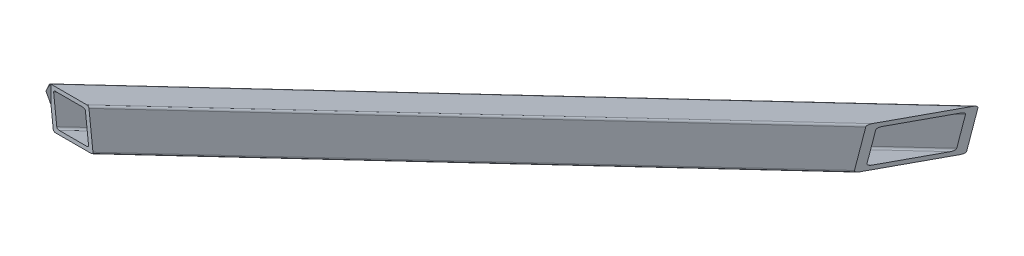
ISO-10303-21;
HEADER;
FILE_DESCRIPTION(('STEP AP214'),'2;1');
FILE_NAME('part.step','',(''),(''),'','','');
FILE_SCHEMA(('AUTOMOTIVE_DESIGN { 1 0 10303 214 1 1 1 1 }'));
ENDSEC;
DATA;
#1=APPLICATION_CONTEXT('core data for automotive mechanical design processes');
#2=APPLICATION_PROTOCOL_DEFINITION('international standard','automotive_design',2000,#1);
#3=PRODUCT_CONTEXT('',#1,'mechanical');
#4=PRODUCT('Part','Part','',(#3));
#5=PRODUCT_RELATED_PRODUCT_CATEGORY('part','',(#4));
#6=PRODUCT_DEFINITION_FORMATION('','',#4);
#7=PRODUCT_DEFINITION_CONTEXT('part definition',#1,'design');
#8=PRODUCT_DEFINITION('design','',#6,#7);
#9=PRODUCT_DEFINITION_SHAPE('','',#8);
#10=(LENGTH_UNIT() NAMED_UNIT(*) SI_UNIT(.MILLI.,.METRE.));
#11=(NAMED_UNIT(*) PLANE_ANGLE_UNIT() SI_UNIT($,.RADIAN.));
#12=(NAMED_UNIT(*) SI_UNIT($,.STERADIAN.) SOLID_ANGLE_UNIT());
#13=UNCERTAINTY_MEASURE_WITH_UNIT(LENGTH_MEASURE(1.E-05),#10,'distance_accuracy_value','');
#14=(GEOMETRIC_REPRESENTATION_CONTEXT(3) GLOBAL_UNCERTAINTY_ASSIGNED_CONTEXT((#13)) GLOBAL_UNIT_ASSIGNED_CONTEXT((#10,
#11,#12)) REPRESENTATION_CONTEXT('',''));
#15=CARTESIAN_POINT('',(0.,0.,0.));
#16=DIRECTION('',(0.,0.,1.));
#17=DIRECTION('',(1.,0.,0.));
#18=AXIS2_PLACEMENT_3D('',#15,#16,#17);
#19=CARTESIAN_POINT('',(258.,-1.11022302462516E-13,729.000000000001));
#20=DIRECTION('',(0.948516525956314,0.105198638371293,-0.298746793242357));
#21=DIRECTION('',(-0.300413720237824,0.,-0.953808993820498));
#22=AXIS2_PLACEMENT_3D('',#19,#20,#21);
#23=PLANE('',#22);
#24=DIRECTION('',(-0.110232699837685,0.993905806345096,0.));
#25=VECTOR('',#24,1.);
#26=CARTESIAN_POINT('',(28.0475956269496,3.11071951705733,0.));
#27=LINE('',#26,#25);
#28=CARTESIAN_POINT('',(2.10849168745859,236.988924938959,0.));
#29=VERTEX_POINT('',#28);
#30=CARTESIAN_POINT('',(0.235096664464664,253.880266561486,0.));
#31=VERTEX_POINT('',#30);
#32=EDGE_CURVE('E167',#29,#31,#27,.T.);
#33=ORIENTED_EDGE('',*,*,#32,.F.);
#34=DIRECTION('',(0.,0.943229300079848,0.332142269924922));
#35=VECTOR('',#34,1.);
#36=CARTESIAN_POINT('',(2.10849168745858,254.529987601225,6.17678900459018));
#37=LINE('',#36,#35);
#38=CARTESIAN_POINT('',(2.10849168745858,252.02139398053,5.29343012311112));
#39=VERTEX_POINT('',#38);
#40=EDGE_CURVE('E151',#29,#39,#37,.T.);
#41=ORIENTED_EDGE('',*,*,#40,.T.);
#42=DIRECTION('',(0.31672753768479,-0.314272285454675,0.89493943787679));
#43=VECTOR('',#42,1.);
#44=CARTESIAN_POINT('',(258.00051714561,-1.88697236554225,728.337176475795));
#45=LINE('',#44,#43);
#46=EDGE_CURVE('E11',#39,#31,#45,.F.);
#47=ORIENTED_EDGE('',*,*,#46,.T.);
#48=EDGE_LOOP('',(#33,#41,#47));
#49=FACE_BOUND('',#48,.T.);
#50=ADVANCED_FACE('F33',(#49),#23,.F.);
#51=CARTESIAN_POINT('',(259.897550197523,-1.67657508879966,727.73968288931));
#52=DIRECTION('',(0.31672753768479,-0.314272285454675,0.89493943787679));
#53=DIRECTION('',(0.942703502643969,0.,-0.33363169229375));
#54=AXIS2_PLACEMENT_3D('',#51,#52,#53);
#55=CYLINDRICAL_SURFACE('',#54,2.);
#56=CARTESIAN_POINT('',(2.10849168745858,254.114118626613,-0.664284761219824));
#57=DIRECTION('',(-1.,0.,0.));
#58=DIRECTION('',(0.,-0.331330309148028,0.943514825659815));
#59=AXIS2_PLACEMENT_3D('',#56,#57,#58);
#60=ELLIPSE('',#59,6.31457565900196,2.);
#61=CARTESIAN_POINT('',(2.10849168745858,256.000577855425,0.));
#62=VERTEX_POINT('',#61);
#63=EDGE_CURVE('E156',#62,#39,#60,.F.);
#64=ORIENTED_EDGE('',*,*,#63,.F.);
#65=CARTESIAN_POINT('',(2.34358835192322,253.880844416911,0.));
#66=DIRECTION('',(0.,0.,1.));
#67=DIRECTION('',(0.709852795777389,-0.704350060926401,0.));
#68=AXIS2_PLACEMENT_3D('',#65,#66,#67);
#69=ELLIPSE('',#68,2.23478809330934,2.);
#70=EDGE_CURVE('E237',#31,#62,#69,.F.);
#71=ORIENTED_EDGE('',*,*,#70,.F.);
#72=ORIENTED_EDGE('',*,*,#46,.F.);
#73=EDGE_LOOP('',(#64,#71,#72));
#74=FACE_BOUND('',#73,.T.);
#75=ADVANCED_FACE('F35',(#74),#55,.T.);
#76=CARTESIAN_POINT('',(258.,260.207945534852,-729.000000000001));
#77=DIRECTION('',(-1.,0.,0.));
#78=DIRECTION('',(0.,0.,-1.));
#79=AXIS2_PLACEMENT_3D('',#76,#77,#78);
#80=PLANE('',#79);
#81=DIRECTION('',(0.,0.33141177318203,0.943486214311763));
#82=VECTOR('',#81,1.);
#83=CARTESIAN_POINT('',(258.,-1.11022302462516E-13,-729.000000000001));
#84=LINE('',#83,#82);
#85=CARTESIAN_POINT('',(258.,2.09272464608221,-723.04228511567));
#86=VERTEX_POINT('',#85);
#87=CARTESIAN_POINT('',(258.,39.7617682755626,-615.803417197714));
#88=VERTEX_POINT('',#87);
#89=EDGE_CURVE('E185',#86,#88,#84,.T.);
#90=ORIENTED_EDGE('',*,*,#89,.T.);
#91=CARTESIAN_POINT('',(258.,37.8753090467495,-615.139132436495));
#92=DIRECTION('',(1.,0.,0.));
#93=DIRECTION('',(0.,0.331330309148029,0.943514825659815));
#94=AXIS2_PLACEMENT_3D('',#91,#92,#93);
#95=ELLIPSE('',#94,6.31457565900196,2.);
#96=CARTESIAN_POINT('',(258.,39.9680336928317,-609.181417552164));
#97=VERTEX_POINT('',#96);
#98=EDGE_CURVE('E217',#97,#88,#95,.F.);
#99=ORIENTED_EDGE('',*,*,#98,.F.);
#100=DIRECTION('',(0.,-0.943229300079848,0.332142269924923));
#101=VECTOR('',#100,1.);
#102=CARTESIAN_POINT('',(258.,41.9467358813206,-609.878184113947));
#103=LINE('',#102,#101);
#104=CARTESIAN_POINT('',(258.,6.01176757419636,-597.224291850213));
#105=VERTEX_POINT('',#104);
#106=EDGE_CURVE('E188',#97,#105,#103,.T.);
#107=ORIENTED_EDGE('',*,*,#106,.T.);
#108=CARTESIAN_POINT('',(258.,3.91904292811412,-603.182006734544));
#109=DIRECTION('',(1.,0.,0.));
#110=DIRECTION('',(0.,0.331330309148028,0.943514825659816));
#111=AXIS2_PLACEMENT_3D('',#108,#109,#110);
#112=ELLIPSE('',#111,6.31457565900196,2.);
#113=CARTESIAN_POINT('',(258.,2.03258369930114,-602.517721973324));
#114=VERTEX_POINT('',#113);
#115=EDGE_CURVE('E220',#114,#105,#112,.F.);
#116=ORIENTED_EDGE('',*,*,#115,.F.);
#117=DIRECTION('',(0.,-0.33141177318203,-0.943486214311763));
#118=VECTOR('',#117,1.);
#119=CARTESIAN_POINT('',(258.,-37.7394498340985,-715.743528629556));
#120=LINE('',#119,#118);
#121=CARTESIAN_POINT('',(258.,-35.6364599301793,-709.756589891279));
#122=VERTEX_POINT('',#121);
#123=EDGE_CURVE('E194',#114,#122,#120,.T.);
#124=ORIENTED_EDGE('',*,*,#123,.T.);
#125=CARTESIAN_POINT('',(258.,-33.7500007013663,-710.420874652499));
#126=DIRECTION('',(1.,0.,0.));
#127=DIRECTION('',(0.,0.331330309148028,0.943514825659816));
#128=AXIS2_PLACEMENT_3D('',#125,#126,#127);
#129=ELLIPSE('',#128,6.31457565900196,2.);
#130=CARTESIAN_POINT('',(258.,-35.8427253474486,-716.37858953683));
#131=VERTEX_POINT('',#130);
#132=EDGE_CURVE('E214',#131,#122,#129,.F.);
#133=ORIENTED_EDGE('',*,*,#132,.F.);
#134=DIRECTION('',(0.,0.943229300079848,-0.332142269924922));
#135=VECTOR('',#134,1.);
#136=CARTESIAN_POINT('',(258.,-1.11022302462516E-13,-729.000000000001));
#137=LINE('',#136,#135);
#138=CARTESIAN_POINT('',(258.,-1.88645922881318,-728.335715238781));
#139=VERTEX_POINT('',#138);
#140=EDGE_CURVE('E191',#131,#139,#137,.T.);
#141=ORIENTED_EDGE('',*,*,#140,.T.);
#142=CARTESIAN_POINT('',(258.,0.206265417269089,-722.37800035445));
#143=DIRECTION('',(1.,0.,0.));
#144=DIRECTION('',(0.,-0.331330309148028,-0.943514825659815));
#145=AXIS2_PLACEMENT_3D('',#142,#143,#144);
#146=ELLIPSE('',#145,6.31457565900196,2.);
#147=EDGE_CURVE('E223',#86,#139,#146,.F.);
#148=ORIENTED_EDGE('',*,*,#147,.F.);
#149=EDGE_LOOP('',(#90,#99,#107,#116,#124,#133,#141,#148));
#150=FACE_BOUND('',#149,.T.);
#151=DIRECTION('',(0.,-0.943229300079845,0.33214226992493));
#152=VECTOR('',#151,1.);
#153=CARTESIAN_POINT('',(258.,235.696872143673,-798.607408307871));
#154=LINE('',#153,#152);
#155=CARTESIAN_POINT('',(258.,-1.47392839427476,-715.09171594768));
#156=VERTEX_POINT('',#155);
#157=CARTESIAN_POINT('',(258.,-27.8843575976576,-705.791729290606));
#158=VERTEX_POINT('',#157);
#159=EDGE_CURVE('E206',#156,#158,#154,.T.);
#160=ORIENTED_EDGE('',*,*,#159,.T.);
#161=CARTESIAN_POINT('',(258.,-25.7916329515754,-699.834014406276));
#162=DIRECTION('',(1.,0.,0.));
#163=DIRECTION('',(0.,-0.331330309148028,-0.943514825659815));
#164=AXIS2_PLACEMENT_3D('',#161,#162,#163);
#165=ELLIPSE('',#164,6.31457565900196,2.);
#166=CARTESIAN_POINT('',(258.,-27.6780921803885,-699.169729645056));
#167=VERTEX_POINT('',#166);
#168=EDGE_CURVE('E41',#167,#158,#165,.T.);
#169=ORIENTED_EDGE('',*,*,#168,.F.);
#170=DIRECTION('',(0.,0.33141177318203,0.943486214311763));
#171=VECTOR('',#170,1.);
#172=CARTESIAN_POINT('',(258.,-5.38588692506198,-635.706720642486));
#173=LINE('',#172,#171);
#174=CARTESIAN_POINT('',(258.,1.62005286476252,-615.761721264425));
#175=VERTEX_POINT('',#174);
#176=EDGE_CURVE('E203',#167,#175,#173,.T.);
#177=ORIENTED_EDGE('',*,*,#176,.T.);
#178=CARTESIAN_POINT('',(258.,3.50651209357564,-616.426006025645));
#179=DIRECTION('',(1.,0.,0.));
#180=DIRECTION('',(0.,-0.331330309148028,-0.943514825659816));
#181=AXIS2_PLACEMENT_3D('',#178,#179,#180);
#182=ELLIPSE('',#181,6.31457565900196,2.);
#183=CARTESIAN_POINT('',(258.,5.5992367396579,-610.468291141314));
#184=VERTEX_POINT('',#183);
#185=EDGE_CURVE('E285',#184,#175,#182,.T.);
#186=ORIENTED_EDGE('',*,*,#185,.F.);
#187=DIRECTION('',(0.,0.943229300079848,-0.332142269924923));
#188=VECTOR('',#187,1.);
#189=CARTESIAN_POINT('',(258.,269.25426084873,-703.309955599027));
#190=LINE('',#189,#188);
#191=CARTESIAN_POINT('',(258.,32.0096659430409,-619.768277798387));
#192=VERTEX_POINT('',#191);
#193=EDGE_CURVE('E200',#184,#192,#190,.T.);
#194=ORIENTED_EDGE('',*,*,#193,.T.);
#195=CARTESIAN_POINT('',(258.,29.9169412969587,-625.725992682718));
#196=DIRECTION('',(1.,0.,0.));
#197=DIRECTION('',(0.,-0.331330309148028,-0.943514825659815));
#198=AXIS2_PLACEMENT_3D('',#195,#196,#197);
#199=ELLIPSE('',#198,6.31457565900196,2.);
#200=CARTESIAN_POINT('',(258.,31.8034005257717,-626.390277443938));
#201=VERTEX_POINT('',#200);
#202=EDGE_CURVE('E279',#201,#192,#199,.T.);
#203=ORIENTED_EDGE('',*,*,#202,.F.);
#204=DIRECTION('',(0.,-0.33141177318203,-0.943486214311763));
#205=VECTOR('',#204,1.);
#206=CARTESIAN_POINT('',(258.,24.8056729422167,-646.311897738842));
#207=LINE('',#206,#205);
#208=CARTESIAN_POINT('',(258.,2.50525548062054,-709.798285824569));
#209=VERTEX_POINT('',#208);
#210=EDGE_CURVE('E197',#201,#209,#207,.T.);
#211=ORIENTED_EDGE('',*,*,#210,.T.);
#212=CARTESIAN_POINT('',(258.,0.6187962518075,-709.134001063349));
#213=DIRECTION('',(1.,0.,0.));
#214=DIRECTION('',(0.,-0.331330309148028,-0.943514825659815));
#215=AXIS2_PLACEMENT_3D('',#212,#213,#214);
#216=ELLIPSE('',#215,6.31457565900196,2.);
#217=EDGE_CURVE('E273',#156,#209,#216,.T.);
#218=ORIENTED_EDGE('',*,*,#217,.F.);
#219=EDGE_LOOP('',(#160,#169,#177,#186,#194,#203,#211,#218));
#220=FACE_BOUND('',#219,.T.);
#221=ADVANCED_FACE('F299',(#150,#220),#80,.F.);
#222=CARTESIAN_POINT('',(258.010342912195,-37.7394473108428,-715.743529515883));
#223=DIRECTION('',(-0.000258572804877655,0.943486182771068,-0.331411762102952));
#224=DIRECTION('',(0.,-0.33141177318203,-0.943486214311763));
#225=AXIS2_PLACEMENT_3D('',#222,#223,#224);
#226=PLANE('',#225);
#227=DIRECTION('',(0.999999962445275,0.000274061030133565,0.));
#228=VECTOR('',#227,1.);
#229=CARTESIAN_POINT('',(257.941440080002,213.674734312422,0.));
#230=LINE('',#229,#228);
#231=CARTESIAN_POINT('',(6.81042497674911,213.60590908514,0.));
#232=VERTEX_POINT('',#231);
#233=CARTESIAN_POINT('',(44.7632753510047,213.6163104828,0.));
#234=VERTEX_POINT('',#233);
#235=EDGE_CURVE('E183',#232,#234,#230,.T.);
#236=ORIENTED_EDGE('',*,*,#235,.F.);
#237=DIRECTION('',(-0.31672753768479,0.314272285454675,0.89493943787679));
#238=VECTOR('',#237,1.);
#239=CARTESIAN_POINT('',(259.907375964108,-37.5290500341002,-715.146035929398));
#240=LINE('',#239,#238);
#241=EDGE_CURVE('E265',#122,#232,#240,.T.);
#242=ORIENTED_EDGE('',*,*,#241,.F.);
#243=ORIENTED_EDGE('',*,*,#123,.F.);
#244=DIRECTION('',(-0.31672753768479,0.314272285454675,0.89493943787679));
#245=VECTOR('',#244,1.);
#246=CARTESIAN_POINT('',(294.053970898535,-33.7418990527337,-704.391151372673));
#247=LINE('',#246,#245);
#248=EDGE_CURVE('E268',#234,#114,#247,.F.);
#249=ORIENTED_EDGE('',*,*,#248,.F.);
#250=EDGE_LOOP('',(#236,#242,#243,#249));
#251=FACE_BOUND('',#250,.T.);
#252=ADVANCED_FACE('F370',(#251),#226,.F.);
#253=CARTESIAN_POINT('',(258.,-1.11022302462516E-13,-729.000000000001));
#254=DIRECTION('',(0.948516525956314,0.105198638371293,0.298746793242357));
#255=DIRECTION('',(-0.300413720237824,0.,0.953808993820498));
#256=AXIS2_PLACEMENT_3D('',#253,#254,#255);
#257=PLANE('',#256);
#258=ORIENTED_EDGE('',*,*,#140,.F.);
#259=DIRECTION('',(-0.31672753768479,0.314272285454675,0.89493943787679));
#260=VECTOR('',#259,1.);
#261=CARTESIAN_POINT('',(258.009825766586,-35.8524749453007,-716.406353040088));
#262=LINE('',#261,#260);
#263=CARTESIAN_POINT('',(4.46683662482604,215.725064668228,0.));
#264=VERTEX_POINT('',#263);
#265=EDGE_CURVE('E174',#264,#131,#262,.F.);
#266=ORIENTED_EDGE('',*,*,#265,.F.);
#267=EDGE_CURVE('E162',#264,#29,#27,.T.);
#268=ORIENTED_EDGE('',*,*,#267,.T.);
#269=ORIENTED_EDGE('',*,*,#32,.T.);
#270=DIRECTION('',(0.31672753768479,-0.314272285454675,-0.89493943787679));
#271=VECTOR('',#270,1.);
#272=CARTESIAN_POINT('',(258.00051714561,-1.88697236554225,-728.337176475795));
#273=LINE('',#272,#271);
#274=EDGE_CURVE('E227',#139,#31,#273,.F.);
#275=ORIENTED_EDGE('',*,*,#274,.F.);
#276=EDGE_LOOP('',(#258,#266,#268,#269,#275));
#277=FACE_BOUND('',#276,.T.);
#278=ADVANCED_FACE('F173',(#277),#257,.F.);
#279=CARTESIAN_POINT('',(295.940661038253,4.2079455348516,-717.050128270306));
#280=DIRECTION('',(-0.948516525956314,-0.105198638371293,-0.298746793242357));
#281=DIRECTION('',(0.300413720237824,0.,-0.953808993820498));
#282=AXIS2_PLACEMENT_3D('',#279,#280,#281);
#283=PLANE('',#282);
#284=ORIENTED_EDGE('',*,*,#106,.F.);
#285=DIRECTION('',(-0.31672753768479,0.314272285454675,0.89493943787679));
#286=VECTOR('',#285,1.);
#287=CARTESIAN_POINT('',(295.941178183863,2.32097316930946,-716.3873047461));
#288=LINE('',#287,#286);
#289=CARTESIAN_POINT('',(42.4049304136377,253.891823669998,0.));
#290=VERTEX_POINT('',#289);
#291=EDGE_CURVE('E260',#290,#97,#288,.F.);
#292=ORIENTED_EDGE('',*,*,#291,.F.);
#293=DIRECTION('',(-0.110232699837685,0.993905806345096,0.));
#294=VECTOR('',#293,1.);
#295=CARTESIAN_POINT('',(72.8413014840615,-20.535691718011,0.));
#296=LINE('',#295,#294);
#297=CARTESIAN_POINT('',(46.636670373999,215.73662177674,0.));
#298=VERTEX_POINT('',#297);
#299=EDGE_CURVE('E176',#298,#290,#296,.T.);
#300=ORIENTED_EDGE('',*,*,#299,.F.);
#301=DIRECTION('',(-0.31672753768479,0.314272285454675,0.89493943787679));
#302=VECTOR('',#301,1.);
#303=CARTESIAN_POINT('',(295.950486804838,-31.644529410449,-704.456481310394));
#304=LINE('',#303,#302);
#305=EDGE_CURVE('E262',#105,#298,#304,.T.);
#306=ORIENTED_EDGE('',*,*,#305,.F.);
#307=EDGE_LOOP('',(#284,#292,#300,#306));
#308=FACE_BOUND('',#307,.T.);
#309=ADVANCED_FACE('F369',(#308),#283,.F.);
#310=CARTESIAN_POINT('',(258.,-1.11022302462516E-13,-729.000000000001));
#311=DIRECTION('',(0.000258572804877672,-0.943486182771068,0.331411762102952));
#312=DIRECTION('',(0.,0.33141177318203,0.943486214311763));
#313=AXIS2_PLACEMENT_3D('',#310,#311,#312);
#314=PLANE('',#313);
#315=DIRECTION('',(-0.999999962445275,-0.000274061030133583,0.));
#316=VECTOR('',#315,1.);
#317=CARTESIAN_POINT('',(257.929821000683,256.0706885151,0.));
#318=LINE('',#317,#316);
#319=CARTESIAN_POINT('',(40.0613419823354,256.01097933185,0.));
#320=VERTEX_POINT('',#319);
#321=EDGE_CURVE('E165',#320,#62,#318,.T.);
#322=ORIENTED_EDGE('',*,*,#321,.F.);
#323=DIRECTION('',(-0.31672753768479,0.314272285454675,0.89493943787679));
#324=VECTOR('',#323,1.);
#325=CARTESIAN_POINT('',(294.04362798634,3.99754825810902,-717.647621856791));
#326=LINE('',#325,#324);
#327=EDGE_CURVE('E209',#88,#320,#326,.T.);
#328=ORIENTED_EDGE('',*,*,#327,.F.);
#329=ORIENTED_EDGE('',*,*,#89,.F.);
#330=DIRECTION('',(0.31672753768479,-0.314272285454675,-0.89493943787679));
#331=VECTOR('',#330,1.);
#332=CARTESIAN_POINT('',(259.897033051913,0.21039727674248,-728.402506413516));
#333=LINE('',#332,#331);
#334=EDGE_CURVE('E212',#62,#86,#333,.T.);
#335=ORIENTED_EDGE('',*,*,#334,.F.);
#336=EDGE_LOOP('',(#322,#328,#329,#335));
#337=FACE_BOUND('',#336,.T.);
#338=ADVANCED_FACE('F332',(#337),#314,.F.);
#339=CARTESIAN_POINT('',(265.550613894426,-7.07955116923331,-737.090874852452));
#340=DIRECTION('',(0.948516525956314,0.105198638371296,0.298746793242356));
#341=DIRECTION('',(-0.300413720237823,0.,0.953808993820498));
#342=AXIS2_PLACEMENT_3D('',#339,#340,#341);
#343=PLANE('',#342);
#344=DIRECTION('',(-0.110232699837688,0.993905806345095,0.));
#345=VECTOR('',#344,1.);
#346=CARTESIAN_POINT('',(32.213464011333,3.57275014032918,0.));
#347=LINE('',#346,#345);
#348=CARTESIAN_POINT('',(8.21362667081439,219.965687256108,0.));
#349=VERTEX_POINT('',#348);
#350=CARTESIAN_POINT('',(4.92227336831105,249.641955395308,0.));
#351=VERTEX_POINT('',#350);
#352=EDGE_CURVE('E170',#349,#351,#347,.T.);
#353=ORIENTED_EDGE('',*,*,#352,.F.);
#354=DIRECTION('',(-0.31672753768479,0.314272285454675,0.89493943787679));
#355=VECTOR('',#354,1.);
#356=CARTESIAN_POINT('',(8.44820618966913,219.732926183136,-0.662823524205838));
#357=LINE('',#356,#355);
#358=EDGE_CURVE('E245',#158,#349,#357,.T.);
#359=ORIENTED_EDGE('',*,*,#358,.F.);
#360=ORIENTED_EDGE('',*,*,#159,.F.);
#361=DIRECTION('',(-0.31672753768479,0.314272285454675,0.89493943787679));
#362=VECTOR('',#361,1.);
#363=CARTESIAN_POINT('',(258.00051714561,-1.47444153100385,-715.093177184694));
#364=LINE('',#363,#362);
#365=EDGE_CURVE('E248',#351,#156,#364,.F.);
#366=ORIENTED_EDGE('',*,*,#365,.F.);
#367=EDGE_LOOP('',(#353,#359,#360,#366));
#368=FACE_BOUND('',#367,.T.);
#369=ADVANCED_FACE('F302',(#368),#343,.T.);
#370=CARTESIAN_POINT('',(265.558888224182,-37.2711090179074,-726.485698465158));
#371=DIRECTION('',(-0.00025857280487756,0.943486182771068,-0.331411762102952));
#372=DIRECTION('',(0.,-0.33141177318203,-0.943486214311763));
#373=AXIS2_PLACEMENT_3D('',#370,#371,#372);
#374=PLANE('',#373);
#375=ORIENTED_EDGE('',*,*,#176,.F.);
#376=DIRECTION('',(-0.31672753768479,0.314272285454675,0.89493943787679));
#377=VECTOR('',#376,1.);
#378=CARTESIAN_POINT('',(259.897033051913,-29.5604195497282,-704.529950942902));
#379=LINE('',#378,#377);
#380=CARTESIAN_POINT('',(10.5572150227377,217.846531673019,0.));
#381=VERTEX_POINT('',#380);
#382=EDGE_CURVE('E255',#381,#167,#379,.F.);
#383=ORIENTED_EDGE('',*,*,#382,.F.);
#384=DIRECTION('',(-0.999999962445275,-0.000274061030133465,0.));
#385=VECTOR('',#384,1.);
#386=CARTESIAN_POINT('',(-0.0597024496925761,217.843621989571,0.));
#387=LINE('',#386,#385);
#388=CARTESIAN_POINT('',(40.0760986471582,217.854621648978,-1.11022302462516E-13));
#389=VERTEX_POINT('',#388);
#390=EDGE_CURVE('E48',#389,#381,#387,.T.);
#391=ORIENTED_EDGE('',*,*,#390,.F.);
#392=DIRECTION('',(-0.31672753768479,0.314272285454675,0.89493943787679));
#393=VECTOR('',#392,1.);
#394=CARTESIAN_POINT('',(40.2875572827042,217.644802227661,-0.597493586484499));
#395=LINE('',#394,#393);
#396=EDGE_CURVE('E257',#175,#389,#395,.T.);
#397=ORIENTED_EDGE('',*,*,#396,.F.);
#398=EDGE_LOOP('',(#375,#383,#391,#397));
#399=FACE_BOUND('',#398,.T.);
#400=ADVANCED_FACE('F324',(#399),#374,.T.);
#401=CARTESIAN_POINT('',(295.903142725028,-3.71319474135196,-727.530977468697));
#402=DIRECTION('',(-0.948516525956314,-0.105198638371293,-0.298746793242357));
#403=DIRECTION('',(0.300413720237824,0.,-0.953808993820498));
#404=AXIS2_PLACEMENT_3D('',#401,#402,#403);
#405=PLANE('',#404);
#406=ORIENTED_EDGE('',*,*,#193,.F.);
#407=DIRECTION('',(-0.31672753768479,0.314272285454675,0.89493943787679));
#408=VECTOR('',#407,1.);
#409=CARTESIAN_POINT('',(257.99948285439,5.59974987638698,-610.4668299043));
#410=LINE('',#409,#408);
#411=CARTESIAN_POINT('',(41.9494936701525,219.974932942918,0.));
#412=VERTEX_POINT('',#411);
#413=EDGE_CURVE('E250',#412,#184,#410,.F.);
#414=ORIENTED_EDGE('',*,*,#413,.F.);
#415=DIRECTION('',(0.110232699837685,-0.993905806345096,0.));
#416=VECTOR('',#415,1.);
#417=CARTESIAN_POINT('',(65.5404110863942,7.26899512650244,0.));
#418=LINE('',#417,#416);
#419=CARTESIAN_POINT('',(38.6581403676492,249.651201082118,0.));
#420=VERTEX_POINT('',#419);
#421=EDGE_CURVE('E303',#420,#412,#418,.T.);
#422=ORIENTED_EDGE('',*,*,#421,.F.);
#423=DIRECTION('',(-0.31672753768479,0.314272285454675,0.89493943787679));
#424=VECTOR('',#423,1.);
#425=CARTESIAN_POINT('',(38.4235608487944,249.88396215509,0.662823524206061));
#426=LINE('',#425,#424);
#427=EDGE_CURVE('E252',#192,#420,#426,.T.);
#428=ORIENTED_EDGE('',*,*,#427,.F.);
#429=EDGE_LOOP('',(#406,#414,#422,#428));
#430=FACE_BOUND('',#429,.T.);
#431=ADVANCED_FACE('F319',(#430),#405,.T.);
#432=CARTESIAN_POINT('',(265.550613894426,-7.07955116923331,-737.090874852452));
#433=DIRECTION('',(0.000258572804878064,-0.943486182771068,0.331411762102952));
#434=DIRECTION('',(0.,0.33141177318203,0.943486214311763));
#435=AXIS2_PLACEMENT_3D('',#432,#433,#434);
#436=PLANE('',#435);
#437=ORIENTED_EDGE('',*,*,#210,.F.);
#438=DIRECTION('',(-0.31672753768479,0.314272285454675,0.89493943787679));
#439=VECTOR('',#438,1.);
#440=CARTESIAN_POINT('',(256.102966948088,33.6857278951114,-621.030056146091));
#441=LINE('',#440,#439);
#442=CARTESIAN_POINT('',(36.314552015726,251.770356665207,0.));
#443=VERTEX_POINT('',#442);
#444=EDGE_CURVE('E240',#443,#201,#441,.F.);
#445=ORIENTED_EDGE('',*,*,#444,.F.);
#446=DIRECTION('',(0.999999962445275,0.000274061030133999,0.));
#447=VECTOR('',#446,1.);
#448=CARTESIAN_POINT('',(-0.0689977131476133,251.760385351713,0.));
#449=LINE('',#448,#447);
#450=CARTESIAN_POINT('',(6.79566839130524,251.762266689248,0.));
#451=VERTEX_POINT('',#450);
#452=EDGE_CURVE('E157',#451,#443,#449,.T.);
#453=ORIENTED_EDGE('',*,*,#452,.F.);
#454=DIRECTION('',(-0.31672753768479,0.314272285454675,0.89493943787679));
#455=VECTOR('',#454,1.);
#456=CARTESIAN_POINT('',(6.58420975575915,251.972086110565,0.597493586484868));
#457=LINE('',#456,#455);
#458=EDGE_CURVE('E242',#209,#451,#457,.T.);
#459=ORIENTED_EDGE('',*,*,#458,.F.);
#460=EDGE_LOOP('',(#437,#445,#453,#459));
#461=FACE_BOUND('',#460,.T.);
#462=ADVANCED_FACE('F311',(#461),#436,.T.);
#463=CARTESIAN_POINT('',(259.897550197523,-1.67657508879966,-727.73968288931));
#464=DIRECTION('',(0.31672753768479,-0.314272285454675,-0.89493943787679));
#465=DIRECTION('',(0.942703502643969,0.,0.33363169229375));
#466=AXIS2_PLACEMENT_3D('',#463,#464,#465);
#467=CYLINDRICAL_SURFACE('',#466,2.);
#468=ORIENTED_EDGE('',*,*,#70,.T.);
#469=ORIENTED_EDGE('',*,*,#334,.T.);
#470=ORIENTED_EDGE('',*,*,#147,.T.);
#471=ORIENTED_EDGE('',*,*,#274,.T.);
#472=EDGE_LOOP('',(#468,#469,#470,#471));
#473=FACE_BOUND('',#472,.T.);
#474=ADVANCED_FACE('F362',(#473),#467,.T.);
#475=CARTESIAN_POINT('',(267.448164091949,-8.75612625803286,-735.830557741761));
#476=DIRECTION('',(0.31672753768479,-0.314272285454675,-0.89493943787679));
#477=DIRECTION('',(0.942703502643969,0.,0.33363169229375));
#478=AXIS2_PLACEMENT_3D('',#475,#476,#477);
#479=CYLINDRICAL_SURFACE('',#478,2.);
#480=ORIENTED_EDGE('',*,*,#217,.T.);
#481=ORIENTED_EDGE('',*,*,#458,.T.);
#482=CARTESIAN_POINT('',(7.03076505576977,249.642533250734,0.));
#483=DIRECTION('',(0.,0.,1.));
#484=DIRECTION('',(0.709852795777389,-0.704350060926401,0.));
#485=AXIS2_PLACEMENT_3D('',#482,#483,#484);
#486=ELLIPSE('',#485,2.23478809330933,2.);
#487=EDGE_CURVE('E270',#451,#351,#486,.T.);
#488=ORIENTED_EDGE('',*,*,#487,.T.);
#489=ORIENTED_EDGE('',*,*,#365,.T.);
#490=EDGE_LOOP('',(#480,#481,#488,#489));
#491=FACE_BOUND('',#490,.T.);
#492=ADVANCED_FACE('F359',(#491),#479,.F.);
#493=CARTESIAN_POINT('',(294.006626818725,-5.8105643836367,-727.465647530976));
#494=DIRECTION('',(0.31672753768479,-0.314272285454675,-0.89493943787679));
#495=DIRECTION('',(0.942703502643969,0.,0.33363169229375));
#496=AXIS2_PLACEMENT_3D('',#493,#494,#495);
#497=CYLINDRICAL_SURFACE('',#496,2.);
#498=ORIENTED_EDGE('',*,*,#202,.T.);
#499=ORIENTED_EDGE('',*,*,#427,.T.);
#500=CARTESIAN_POINT('',(36.5496486801906,249.650623226692,0.));
#501=DIRECTION('',(0.,0.,1.));
#502=DIRECTION('',(0.709852795777389,-0.704350060926401,0.));
#503=AXIS2_PLACEMENT_3D('',#500,#501,#502);
#504=ELLIPSE('',#503,2.23478809330934,2.);
#505=EDGE_CURVE('E276',#420,#443,#504,.T.);
#506=ORIENTED_EDGE('',*,*,#505,.T.);
#507=ORIENTED_EDGE('',*,*,#444,.T.);
#508=EDGE_LOOP('',(#498,#499,#506,#507));
#509=FACE_BOUND('',#508,.T.);
#510=ADVANCED_FACE('F314',(#509),#497,.F.);
#511=CARTESIAN_POINT('',(294.013866857262,-32.2281775012265,-718.186118192093));
#512=DIRECTION('',(0.31672753768479,-0.314272285454675,-0.89493943787679));
#513=DIRECTION('',(0.942703502643969,0.,0.33363169229375));
#514=AXIS2_PLACEMENT_3D('',#511,#512,#513);
#515=CYLINDRICAL_SURFACE('',#514,2.);
#516=ORIENTED_EDGE('',*,*,#185,.T.);
#517=ORIENTED_EDGE('',*,*,#396,.T.);
#518=CARTESIAN_POINT('',(39.8410019826938,219.974355087492,0.));
#519=DIRECTION('',(0.,0.,1.));
#520=DIRECTION('',(0.709852795777389,-0.704350060926401,0.));
#521=AXIS2_PLACEMENT_3D('',#518,#519,#520);
#522=ELLIPSE('',#521,2.23478809330933,2.);
#523=EDGE_CURVE('E282',#389,#412,#522,.T.);
#524=ORIENTED_EDGE('',*,*,#523,.T.);
#525=ORIENTED_EDGE('',*,*,#413,.T.);
#526=EDGE_LOOP('',(#516,#517,#524,#525));
#527=FACE_BOUND('',#526,.T.);
#528=ADVANCED_FACE('F321',(#527),#515,.F.);
#529=CARTESIAN_POINT('',(267.455404130485,-35.1737393756226,-726.551028402879));
#530=DIRECTION('',(0.31672753768479,-0.314272285454675,-0.89493943787679));
#531=DIRECTION('',(0.942703502643969,0.,0.33363169229375));
#532=AXIS2_PLACEMENT_3D('',#529,#530,#531);
#533=CYLINDRICAL_SURFACE('',#532,2.);
#534=ORIENTED_EDGE('',*,*,#168,.T.);
#535=ORIENTED_EDGE('',*,*,#358,.T.);
#536=CARTESIAN_POINT('',(10.3221183582731,219.966265111534,0.));
#537=DIRECTION('',(0.,0.,1.));
#538=DIRECTION('',(0.709852795777389,-0.704350060926401,0.));
#539=AXIS2_PLACEMENT_3D('',#536,#537,#538);
#540=ELLIPSE('',#539,2.23478809330934,2.);
#541=EDGE_CURVE('E288',#349,#381,#540,.T.);
#542=ORIENTED_EDGE('',*,*,#541,.T.);
#543=ORIENTED_EDGE('',*,*,#382,.T.);
#544=EDGE_LOOP('',(#534,#535,#542,#543));
#545=FACE_BOUND('',#544,.T.);
#546=ADVANCED_FACE('F293',(#545),#533,.F.);
#547=CARTESIAN_POINT('',(294.053453752925,-31.8549266871916,-705.053974896879));
#548=DIRECTION('',(-0.31672753768479,0.314272285454675,0.89493943787679));
#549=DIRECTION('',(-0.942703502643969,0.,-0.33363169229375));
#550=AXIS2_PLACEMENT_3D('',#547,#548,#549);
#551=CYLINDRICAL_SURFACE('',#550,2.);
#552=ORIENTED_EDGE('',*,*,#115,.T.);
#553=ORIENTED_EDGE('',*,*,#305,.T.);
#554=CARTESIAN_POINT('',(44.5281786865403,215.736043921314,0.));
#555=DIRECTION('',(0.,0.,1.));
#556=DIRECTION('',(-0.709852795777389,0.704350060926401,0.));
#557=AXIS2_PLACEMENT_3D('',#554,#555,#556);
#558=ELLIPSE('',#557,2.23478809330934,2.);
#559=EDGE_CURVE('E234',#298,#234,#558,.F.);
#560=ORIENTED_EDGE('',*,*,#559,.T.);
#561=ORIENTED_EDGE('',*,*,#248,.T.);
#562=EDGE_LOOP('',(#552,#553,#560,#561));
#563=FACE_BOUND('',#562,.T.);
#564=ADVANCED_FACE('F348',(#563),#551,.T.);
#565=CARTESIAN_POINT('',(294.04414513195,2.11057589256687,-716.984798332585));
#566=DIRECTION('',(-0.31672753768479,0.314272285454675,0.89493943787679));
#567=DIRECTION('',(-0.942703502643969,0.,-0.33363169229375));
#568=AXIS2_PLACEMENT_3D('',#565,#566,#567);
#569=CYLINDRICAL_SURFACE('',#568,2.);
#570=ORIENTED_EDGE('',*,*,#98,.T.);
#571=ORIENTED_EDGE('',*,*,#327,.T.);
#572=CARTESIAN_POINT('',(40.296438726179,253.891245814572,0.));
#573=DIRECTION('',(0.,0.,1.));
#574=DIRECTION('',(-0.709852795777389,0.704350060926401,0.));
#575=AXIS2_PLACEMENT_3D('',#572,#573,#574);
#576=ELLIPSE('',#575,2.23478809330934,2.);
#577=EDGE_CURVE('E232',#320,#290,#576,.F.);
#578=ORIENTED_EDGE('',*,*,#577,.T.);
#579=ORIENTED_EDGE('',*,*,#291,.T.);
#580=EDGE_LOOP('',(#570,#571,#578,#579));
#581=FACE_BOUND('',#580,.T.);
#582=ADVANCED_FACE('F344',(#581),#569,.T.);
#583=CARTESIAN_POINT('',(259.906858818498,-35.6420776685581,-715.808859453604));
#584=DIRECTION('',(-0.31672753768479,0.314272285454675,0.89493943787679));
#585=DIRECTION('',(-0.942703502643969,0.,-0.33363169229375));
#586=AXIS2_PLACEMENT_3D('',#583,#584,#585);
#587=CYLINDRICAL_SURFACE('',#586,2.);
#588=ORIENTED_EDGE('',*,*,#132,.T.);
#589=ORIENTED_EDGE('',*,*,#241,.T.);
#590=CARTESIAN_POINT('',(6.57532831228463,215.725642523654,0.));
#591=DIRECTION('',(0.,0.,1.));
#592=DIRECTION('',(-0.709852795777389,0.704350060926401,0.));
#593=AXIS2_PLACEMENT_3D('',#590,#591,#592);
#594=ELLIPSE('',#593,2.23478809330933,2.);
#595=EDGE_CURVE('E230',#232,#264,#594,.F.);
#596=ORIENTED_EDGE('',*,*,#595,.T.);
#597=ORIENTED_EDGE('',*,*,#265,.T.);
#598=EDGE_LOOP('',(#588,#589,#596,#597));
#599=FACE_BOUND('',#598,.T.);
#600=ADVANCED_FACE('F341',(#599),#587,.T.);
#601=CARTESIAN_POINT('',(2.10849168745858,-36.5674862587905,0.));
#602=DIRECTION('',(-1.,0.,0.));
#603=DIRECTION('',(0.,0.,1.));
#604=AXIS2_PLACEMENT_3D('',#601,#602,#603);
#605=PLANE('',#604);
#606=DIRECTION('',(0.,1.,0.));
#607=VECTOR('',#606,1.);
#608=CARTESIAN_POINT('',(2.10849168745858,-36.5674862587905,0.));
#609=LINE('',#608,#607);
#610=EDGE_CURVE('E154',#29,#62,#609,.T.);
#611=ORIENTED_EDGE('',*,*,#610,.T.);
#612=ORIENTED_EDGE('',*,*,#63,.T.);
#613=ORIENTED_EDGE('',*,*,#40,.F.);
#614=EDGE_LOOP('',(#611,#612,#613));
#615=FACE_BOUND('',#614,.T.);
#616=ADVANCED_FACE('F153',(#615),#605,.F.);
#617=CARTESIAN_POINT('',(2.10849168745858,-36.5674862587905,0.));
#618=DIRECTION('',(0.,0.,-1.));
#619=DIRECTION('',(-1.,0.,0.));
#620=AXIS2_PLACEMENT_3D('',#617,#618,#619);
#621=PLANE('',#620);
#622=ORIENTED_EDGE('',*,*,#421,.T.);
#623=ORIENTED_EDGE('',*,*,#523,.F.);
#624=ORIENTED_EDGE('',*,*,#390,.T.);
#625=ORIENTED_EDGE('',*,*,#541,.F.);
#626=ORIENTED_EDGE('',*,*,#352,.T.);
#627=ORIENTED_EDGE('',*,*,#487,.F.);
#628=ORIENTED_EDGE('',*,*,#452,.T.);
#629=ORIENTED_EDGE('',*,*,#505,.F.);
#630=EDGE_LOOP('',(#622,#623,#624,#625,#626,#627,#628,#629));
#631=FACE_BOUND('',#630,.T.);
#632=ORIENTED_EDGE('',*,*,#610,.F.);
#633=ORIENTED_EDGE('',*,*,#267,.F.);
#634=ORIENTED_EDGE('',*,*,#595,.F.);
#635=ORIENTED_EDGE('',*,*,#235,.T.);
#636=ORIENTED_EDGE('',*,*,#559,.F.);
#637=ORIENTED_EDGE('',*,*,#299,.T.);
#638=ORIENTED_EDGE('',*,*,#577,.F.);
#639=ORIENTED_EDGE('',*,*,#321,.T.);
#640=EDGE_LOOP('',(#632,#633,#634,#635,#636,#637,#638,#639));
#641=FACE_BOUND('',#640,.T.);
#642=ADVANCED_FACE('F160',(#631,#641),#621,.F.);
#643=CLOSED_SHELL('',(#50,#75,#221,#252,#278,#309,#338,#369,#400,#431,#462,#474,#492,#510,#528,
#546,#564,#582,#600,#616,#642));
#644=MANIFOLD_SOLID_BREP('B2',#643);
#645=ADVANCED_BREP_SHAPE_REPRESENTATION('',(#18,#644),#14);
#646=SHAPE_DEFINITION_REPRESENTATION(#9,#645);
ENDSEC;
END-ISO-10303-21;
